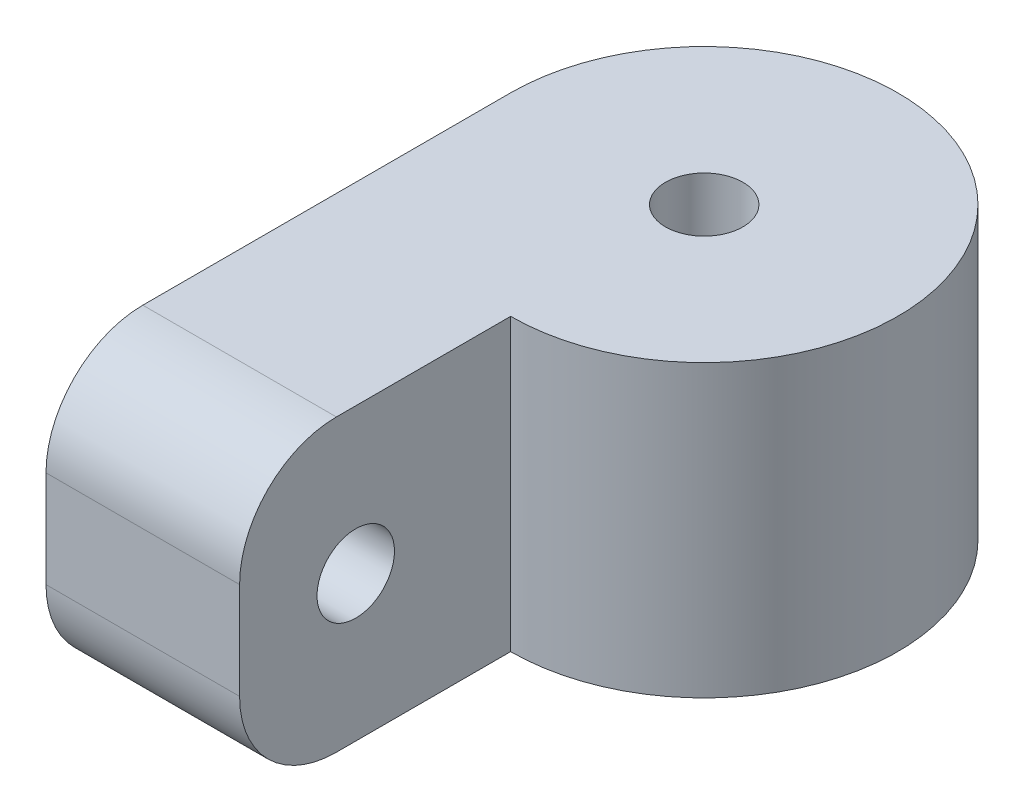
ISO-10303-21;
HEADER;
FILE_DESCRIPTION(('STEP AP214'),'2;1');
FILE_NAME('part.step','',(''),(''),'','','');
FILE_SCHEMA(('AUTOMOTIVE_DESIGN { 1 0 10303 214 1 1 1 1 }'));
ENDSEC;
DATA;
#1=APPLICATION_CONTEXT('core data for automotive mechanical design processes');
#2=APPLICATION_PROTOCOL_DEFINITION('international standard','automotive_design',2000,#1);
#3=PRODUCT_CONTEXT('',#1,'mechanical');
#4=PRODUCT('Part','Part','',(#3));
#5=PRODUCT_RELATED_PRODUCT_CATEGORY('part','',(#4));
#6=PRODUCT_DEFINITION_FORMATION('','',#4);
#7=PRODUCT_DEFINITION_CONTEXT('part definition',#1,'design');
#8=PRODUCT_DEFINITION('design','',#6,#7);
#9=PRODUCT_DEFINITION_SHAPE('','',#8);
#10=(LENGTH_UNIT() NAMED_UNIT(*) SI_UNIT(.MILLI.,.METRE.));
#11=(NAMED_UNIT(*) PLANE_ANGLE_UNIT() SI_UNIT($,.RADIAN.));
#12=(NAMED_UNIT(*) SI_UNIT($,.STERADIAN.) SOLID_ANGLE_UNIT());
#13=UNCERTAINTY_MEASURE_WITH_UNIT(LENGTH_MEASURE(1.E-05),#10,'distance_accuracy_value','');
#14=(GEOMETRIC_REPRESENTATION_CONTEXT(3) GLOBAL_UNCERTAINTY_ASSIGNED_CONTEXT((#13)) GLOBAL_UNIT_ASSIGNED_CONTEXT((#10,
#11,#12)) REPRESENTATION_CONTEXT('',''));
#15=CARTESIAN_POINT('',(0.,0.,0.));
#16=DIRECTION('',(0.,0.,1.));
#17=DIRECTION('',(1.,0.,0.));
#18=AXIS2_PLACEMENT_3D('',#15,#16,#17);
#19=CARTESIAN_POINT('',(10.,15.,-12.));
#20=DIRECTION('',(0.,-1.,0.));
#21=DIRECTION('',(0.,0.,-1.));
#22=AXIS2_PLACEMENT_3D('',#19,#20,#21);
#23=CYLINDRICAL_SURFACE('',#22,10.);
#24=CARTESIAN_POINT('',(10.,0.,-12.));
#25=DIRECTION('',(0.,1.,0.));
#26=DIRECTION('',(0.,0.,1.));
#27=AXIS2_PLACEMENT_3D('',#24,#25,#26);
#28=CIRCLE('',#27,10.);
#29=CARTESIAN_POINT('',(9.99999999999999,0.,-1.99999999999999));
#30=VERTEX_POINT('',#29);
#31=CARTESIAN_POINT('',(0.,0.,-12.));
#32=VERTEX_POINT('',#31);
#33=EDGE_CURVE('E118',#30,#32,#28,.T.);
#34=ORIENTED_EDGE('',*,*,#33,.T.);
#35=DIRECTION('',(0.,-1.,0.));
#36=VECTOR('',#35,1.);
#37=CARTESIAN_POINT('',(0.,15.,-12.));
#38=LINE('',#37,#36);
#39=CARTESIAN_POINT('',(0.,15.,-12.));
#40=VERTEX_POINT('',#39);
#41=EDGE_CURVE('E99',#40,#32,#38,.T.);
#42=ORIENTED_EDGE('',*,*,#41,.F.);
#43=CARTESIAN_POINT('',(10.,15.,-12.));
#44=DIRECTION('',(0.,1.,0.));
#45=DIRECTION('',(0.,0.,1.));
#46=AXIS2_PLACEMENT_3D('',#43,#44,#45);
#47=CIRCLE('',#46,10.);
#48=CARTESIAN_POINT('',(9.99999999999999,15.,-1.99999999999999));
#49=VERTEX_POINT('',#48);
#50=EDGE_CURVE('E105',#49,#40,#47,.T.);
#51=ORIENTED_EDGE('',*,*,#50,.F.);
#52=DIRECTION('',(0.,-1.,0.));
#53=VECTOR('',#52,1.);
#54=CARTESIAN_POINT('',(9.99999999999999,15.,-1.99999999999999));
#55=LINE('',#54,#53);
#56=EDGE_CURVE('E169',#49,#30,#55,.T.);
#57=ORIENTED_EDGE('',*,*,#56,.T.);
#58=EDGE_LOOP('',(#34,#42,#51,#57));
#59=FACE_BOUND('',#58,.T.);
#60=ADVANCED_FACE('F41',(#59),#23,.T.);
#61=CARTESIAN_POINT('',(0.,15.,0.));
#62=DIRECTION('',(1.,0.,0.));
#63=DIRECTION('',(0.,0.,-1.));
#64=AXIS2_PLACEMENT_3D('',#61,#62,#63);
#65=PLANE('',#64);
#66=CARTESIAN_POINT('',(0.,7.5,6.));
#67=DIRECTION('',(1.,0.,0.));
#68=DIRECTION('',(0.,0.,-1.));
#69=AXIS2_PLACEMENT_3D('',#66,#67,#68);
#70=CIRCLE('',#69,2.);
#71=CARTESIAN_POINT('',(0.,7.5,4.));
#72=VERTEX_POINT('',#71);
#73=EDGE_CURVE('E179',#72,#72,#70,.T.);
#74=ORIENTED_EDGE('',*,*,#73,.T.);
#75=EDGE_LOOP('',(#74));
#76=FACE_BOUND('',#75,.T.);
#77=DIRECTION('',(0.,0.,1.));
#78=VECTOR('',#77,1.);
#79=CARTESIAN_POINT('',(0.,0.,0.));
#80=LINE('',#79,#78);
#81=CARTESIAN_POINT('',(0.,0.,7.));
#82=VERTEX_POINT('',#81);
#83=EDGE_CURVE('E146',#32,#82,#80,.T.);
#84=ORIENTED_EDGE('',*,*,#83,.T.);
#85=CARTESIAN_POINT('',(0.,5.,7.));
#86=DIRECTION('',(1.,0.,0.));
#87=DIRECTION('',(0.,0.,-1.));
#88=AXIS2_PLACEMENT_3D('',#85,#86,#87);
#89=CIRCLE('',#88,5.);
#90=CARTESIAN_POINT('',(0.,5.,12.));
#91=VERTEX_POINT('',#90);
#92=EDGE_CURVE('E50',#82,#91,#89,.F.);
#93=ORIENTED_EDGE('',*,*,#92,.T.);
#94=DIRECTION('',(0.,-1.,0.));
#95=VECTOR('',#94,1.);
#96=CARTESIAN_POINT('',(0.,15.,12.));
#97=LINE('',#96,#95);
#98=CARTESIAN_POINT('',(0.,10.,12.));
#99=VERTEX_POINT('',#98);
#100=EDGE_CURVE('E121',#99,#91,#97,.T.);
#101=ORIENTED_EDGE('',*,*,#100,.F.);
#102=CARTESIAN_POINT('',(0.,10.,7.));
#103=DIRECTION('',(1.,0.,0.));
#104=DIRECTION('',(0.,0.,-1.));
#105=AXIS2_PLACEMENT_3D('',#102,#103,#104);
#106=CIRCLE('',#105,5.);
#107=CARTESIAN_POINT('',(0.,15.,7.));
#108=VERTEX_POINT('',#107);
#109=EDGE_CURVE('E57',#99,#108,#106,.F.);
#110=ORIENTED_EDGE('',*,*,#109,.T.);
#111=DIRECTION('',(0.,0.,1.));
#112=VECTOR('',#111,1.);
#113=CARTESIAN_POINT('',(0.,15.,0.));
#114=LINE('',#113,#112);
#115=EDGE_CURVE('E95',#40,#108,#114,.T.);
#116=ORIENTED_EDGE('',*,*,#115,.F.);
#117=ORIENTED_EDGE('',*,*,#41,.T.);
#118=EDGE_LOOP('',(#84,#93,#101,#110,#116,#117));
#119=FACE_BOUND('',#118,.T.);
#120=ADVANCED_FACE('F97',(#76,#119),#65,.F.);
#121=CARTESIAN_POINT('',(0.,15.,12.));
#122=DIRECTION('',(0.,0.,-1.));
#123=DIRECTION('',(-1.,0.,0.));
#124=AXIS2_PLACEMENT_3D('',#121,#122,#123);
#125=PLANE('',#124);
#126=ORIENTED_EDGE('',*,*,#100,.T.);
#127=DIRECTION('',(1.,0.,0.));
#128=VECTOR('',#127,1.);
#129=CARTESIAN_POINT('',(0.,5.,12.));
#130=LINE('',#129,#128);
#131=CARTESIAN_POINT('',(10.,5.,12.));
#132=VERTEX_POINT('',#131);
#133=EDGE_CURVE('E125',#91,#132,#130,.T.);
#134=ORIENTED_EDGE('',*,*,#133,.T.);
#135=DIRECTION('',(0.,-1.,0.));
#136=VECTOR('',#135,1.);
#137=CARTESIAN_POINT('',(10.,15.,12.));
#138=LINE('',#137,#136);
#139=CARTESIAN_POINT('',(10.,10.,12.));
#140=VERTEX_POINT('',#139);
#141=EDGE_CURVE('E128',#140,#132,#138,.T.);
#142=ORIENTED_EDGE('',*,*,#141,.F.);
#143=DIRECTION('',(1.,0.,0.));
#144=VECTOR('',#143,1.);
#145=CARTESIAN_POINT('',(0.,10.,12.));
#146=LINE('',#145,#144);
#147=EDGE_CURVE('E120',#140,#99,#146,.F.);
#148=ORIENTED_EDGE('',*,*,#147,.T.);
#149=EDGE_LOOP('',(#126,#134,#142,#148));
#150=FACE_BOUND('',#149,.T.);
#151=ADVANCED_FACE('F150',(#150),#125,.F.);
#152=CARTESIAN_POINT('',(9.99999999999999,15.,0.));
#153=DIRECTION('',(-1.,0.,0.));
#154=DIRECTION('',(0.,0.,1.));
#155=AXIS2_PLACEMENT_3D('',#152,#153,#154);
#156=PLANE('',#155);
#157=CARTESIAN_POINT('',(10.,7.5,6.));
#158=DIRECTION('',(1.,0.,0.));
#159=DIRECTION('',(0.,0.,-1.));
#160=AXIS2_PLACEMENT_3D('',#157,#158,#159);
#161=CIRCLE('',#160,2.);
#162=CARTESIAN_POINT('',(10.,7.5,4.));
#163=VERTEX_POINT('',#162);
#164=EDGE_CURVE('E182',#163,#163,#161,.T.);
#165=ORIENTED_EDGE('',*,*,#164,.F.);
#166=EDGE_LOOP('',(#165));
#167=FACE_BOUND('',#166,.T.);
#168=ORIENTED_EDGE('',*,*,#141,.T.);
#169=CARTESIAN_POINT('',(10.,5.,7.));
#170=DIRECTION('',(-1.,0.,0.));
#171=DIRECTION('',(0.,0.,1.));
#172=AXIS2_PLACEMENT_3D('',#169,#170,#171);
#173=CIRCLE('',#172,5.);
#174=CARTESIAN_POINT('',(10.,0.,7.));
#175=VERTEX_POINT('',#174);
#176=EDGE_CURVE('E138',#132,#175,#173,.F.);
#177=ORIENTED_EDGE('',*,*,#176,.T.);
#178=DIRECTION('',(0.,0.,-1.));
#179=VECTOR('',#178,1.);
#180=CARTESIAN_POINT('',(9.99999999999999,0.,0.));
#181=LINE('',#180,#179);
#182=EDGE_CURVE('E157',#175,#30,#181,.T.);
#183=ORIENTED_EDGE('',*,*,#182,.T.);
#184=ORIENTED_EDGE('',*,*,#56,.F.);
#185=DIRECTION('',(0.,0.,-1.));
#186=VECTOR('',#185,1.);
#187=CARTESIAN_POINT('',(9.99999999999999,15.,0.));
#188=LINE('',#187,#186);
#189=CARTESIAN_POINT('',(10.,15.,7.));
#190=VERTEX_POINT('',#189);
#191=EDGE_CURVE('E104',#190,#49,#188,.T.);
#192=ORIENTED_EDGE('',*,*,#191,.F.);
#193=CARTESIAN_POINT('',(10.,10.,7.));
#194=DIRECTION('',(-1.,0.,0.));
#195=DIRECTION('',(0.,0.,1.));
#196=AXIS2_PLACEMENT_3D('',#193,#194,#195);
#197=CIRCLE('',#196,5.);
#198=EDGE_CURVE('E135',#190,#140,#197,.F.);
#199=ORIENTED_EDGE('',*,*,#198,.T.);
#200=EDGE_LOOP('',(#168,#177,#183,#184,#192,#199));
#201=FACE_BOUND('',#200,.T.);
#202=ADVANCED_FACE('F156',(#167,#201),#156,.F.);
#203=CARTESIAN_POINT('',(9.99999999999999,15.,-12.));
#204=DIRECTION('',(0.,-1.,0.));
#205=DIRECTION('',(0.,0.,-1.));
#206=AXIS2_PLACEMENT_3D('',#203,#204,#205);
#207=CYLINDRICAL_SURFACE('',#206,2.);
#208=CARTESIAN_POINT('',(9.99999999999999,15.,-12.));
#209=DIRECTION('',(0.,1.,0.));
#210=DIRECTION('',(0.,0.,1.));
#211=AXIS2_PLACEMENT_3D('',#208,#209,#210);
#212=CIRCLE('',#211,2.);
#213=CARTESIAN_POINT('',(9.99999999999999,15.,-10.));
#214=VERTEX_POINT('',#213);
#215=EDGE_CURVE('E171',#214,#214,#212,.T.);
#216=ORIENTED_EDGE('',*,*,#215,.T.);
#217=EDGE_LOOP('',(#216));
#218=FACE_BOUND('',#217,.T.);
#219=CARTESIAN_POINT('',(9.99999999999999,0.,-12.));
#220=DIRECTION('',(0.,1.,0.));
#221=DIRECTION('',(0.,0.,1.));
#222=AXIS2_PLACEMENT_3D('',#219,#220,#221);
#223=CIRCLE('',#222,2.);
#224=CARTESIAN_POINT('',(9.99999999999999,0.,-10.));
#225=VERTEX_POINT('',#224);
#226=EDGE_CURVE('E115',#225,#225,#223,.T.);
#227=ORIENTED_EDGE('',*,*,#226,.F.);
#228=EDGE_LOOP('',(#227));
#229=FACE_BOUND('',#228,.T.);
#230=ADVANCED_FACE('F194',(#218,#229),#207,.F.);
#231=CARTESIAN_POINT('',(0.,15.,0.));
#232=DIRECTION('',(0.,1.,0.));
#233=DIRECTION('',(0.,0.,1.));
#234=AXIS2_PLACEMENT_3D('',#231,#232,#233);
#235=PLANE('',#234);
#236=ORIENTED_EDGE('',*,*,#115,.T.);
#237=DIRECTION('',(1.,0.,0.));
#238=VECTOR('',#237,1.);
#239=CARTESIAN_POINT('',(10.,15.,7.));
#240=LINE('',#239,#238);
#241=EDGE_CURVE('E11',#108,#190,#240,.T.);
#242=ORIENTED_EDGE('',*,*,#241,.T.);
#243=ORIENTED_EDGE('',*,*,#191,.T.);
#244=ORIENTED_EDGE('',*,*,#50,.T.);
#245=EDGE_LOOP('',(#236,#242,#243,#244));
#246=FACE_BOUND('',#245,.T.);
#247=ORIENTED_EDGE('',*,*,#215,.F.);
#248=EDGE_LOOP('',(#247));
#249=FACE_BOUND('',#248,.T.);
#250=ADVANCED_FACE('F108',(#246,#249),#235,.T.);
#251=CARTESIAN_POINT('',(0.,0.,0.));
#252=DIRECTION('',(0.,1.,0.));
#253=DIRECTION('',(0.,0.,1.));
#254=AXIS2_PLACEMENT_3D('',#251,#252,#253);
#255=PLANE('',#254);
#256=ORIENTED_EDGE('',*,*,#182,.F.);
#257=DIRECTION('',(1.,0.,0.));
#258=VECTOR('',#257,1.);
#259=CARTESIAN_POINT('',(0.,0.,7.));
#260=LINE('',#259,#258);
#261=EDGE_CURVE('E65',#175,#82,#260,.F.);
#262=ORIENTED_EDGE('',*,*,#261,.T.);
#263=ORIENTED_EDGE('',*,*,#83,.F.);
#264=ORIENTED_EDGE('',*,*,#33,.F.);
#265=EDGE_LOOP('',(#256,#262,#263,#264));
#266=FACE_BOUND('',#265,.T.);
#267=ORIENTED_EDGE('',*,*,#226,.T.);
#268=EDGE_LOOP('',(#267));
#269=FACE_BOUND('',#268,.T.);
#270=ADVANCED_FACE('F158',(#266,#269),#255,.F.);
#271=CARTESIAN_POINT('',(0.,5.,7.));
#272=DIRECTION('',(1.,0.,0.));
#273=DIRECTION('',(0.,0.,-1.));
#274=AXIS2_PLACEMENT_3D('',#271,#272,#273);
#275=CYLINDRICAL_SURFACE('',#274,5.);
#276=ORIENTED_EDGE('',*,*,#92,.F.);
#277=ORIENTED_EDGE('',*,*,#261,.F.);
#278=ORIENTED_EDGE('',*,*,#176,.F.);
#279=ORIENTED_EDGE('',*,*,#133,.F.);
#280=EDGE_LOOP('',(#276,#277,#278,#279));
#281=FACE_BOUND('',#280,.T.);
#282=ADVANCED_FACE('F154',(#281),#275,.T.);
#283=CARTESIAN_POINT('',(0.,10.,7.));
#284=DIRECTION('',(-1.,0.,0.));
#285=DIRECTION('',(0.,0.,1.));
#286=AXIS2_PLACEMENT_3D('',#283,#284,#285);
#287=CYLINDRICAL_SURFACE('',#286,5.);
#288=ORIENTED_EDGE('',*,*,#109,.F.);
#289=ORIENTED_EDGE('',*,*,#147,.F.);
#290=ORIENTED_EDGE('',*,*,#198,.F.);
#291=ORIENTED_EDGE('',*,*,#241,.F.);
#292=EDGE_LOOP('',(#288,#289,#290,#291));
#293=FACE_BOUND('',#292,.T.);
#294=ADVANCED_FACE('F43',(#293),#287,.T.);
#295=CARTESIAN_POINT('',(0.,7.5,6.));
#296=DIRECTION('',(1.,0.,0.));
#297=DIRECTION('',(0.,0.,-1.));
#298=AXIS2_PLACEMENT_3D('',#295,#296,#297);
#299=CYLINDRICAL_SURFACE('',#298,2.);
#300=ORIENTED_EDGE('',*,*,#73,.F.);
#301=EDGE_LOOP('',(#300));
#302=FACE_BOUND('',#301,.T.);
#303=ORIENTED_EDGE('',*,*,#164,.T.);
#304=EDGE_LOOP('',(#303));
#305=FACE_BOUND('',#304,.T.);
#306=ADVANCED_FACE('F191',(#302,#305),#299,.F.);
#307=CLOSED_SHELL('',(#60,#120,#151,#202,#230,#250,#270,#282,#294,#306));
#308=MANIFOLD_SOLID_BREP('B2',#307);
#309=ADVANCED_BREP_SHAPE_REPRESENTATION('',(#18,#308),#14);
#310=SHAPE_DEFINITION_REPRESENTATION(#9,#309);
ENDSEC;
END-ISO-10303-21;
